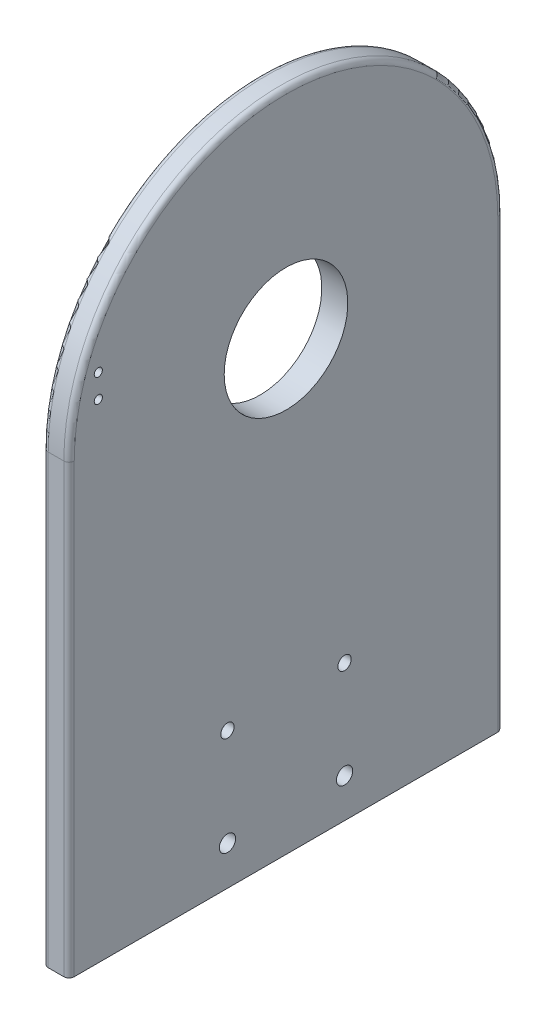
ISO-10303-21;
HEADER;
FILE_DESCRIPTION(('STEP AP214'),'2;1');
FILE_NAME('part.step','',(''),(''),'','','');
FILE_SCHEMA(('AUTOMOTIVE_DESIGN { 1 0 10303 214 1 1 1 1 }'));
ENDSEC;
DATA;
#1=APPLICATION_CONTEXT('core data for automotive mechanical design processes');
#2=APPLICATION_PROTOCOL_DEFINITION('international standard','automotive_design',2000,#1);
#3=PRODUCT_CONTEXT('',#1,'mechanical');
#4=PRODUCT('Part','Part','',(#3));
#5=PRODUCT_RELATED_PRODUCT_CATEGORY('part','',(#4));
#6=PRODUCT_DEFINITION_FORMATION('','',#4);
#7=PRODUCT_DEFINITION_CONTEXT('part definition',#1,'design');
#8=PRODUCT_DEFINITION('design','',#6,#7);
#9=PRODUCT_DEFINITION_SHAPE('','',#8);
#10=(LENGTH_UNIT() NAMED_UNIT(*) SI_UNIT(.MILLI.,.METRE.));
#11=(NAMED_UNIT(*) PLANE_ANGLE_UNIT() SI_UNIT($,.RADIAN.));
#12=(NAMED_UNIT(*) SI_UNIT($,.STERADIAN.) SOLID_ANGLE_UNIT());
#13=UNCERTAINTY_MEASURE_WITH_UNIT(LENGTH_MEASURE(1.E-05),#10,'distance_accuracy_value','');
#14=(GEOMETRIC_REPRESENTATION_CONTEXT(3) GLOBAL_UNCERTAINTY_ASSIGNED_CONTEXT((#13)) GLOBAL_UNIT_ASSIGNED_CONTEXT((#10,
#11,#12)) REPRESENTATION_CONTEXT('',''));
#15=CARTESIAN_POINT('',(0.,0.,0.));
#16=DIRECTION('',(0.,0.,1.));
#17=DIRECTION('',(1.,0.,0.));
#18=AXIS2_PLACEMENT_3D('',#15,#16,#17);
#19=CARTESIAN_POINT('',(-124.,102.,-33.35));
#20=DIRECTION('',(1.,0.,0.));
#21=DIRECTION('',(0.,0.,-1.));
#22=AXIS2_PLACEMENT_3D('',#19,#20,#21);
#23=PLANE('',#22);
#24=CARTESIAN_POINT('',(-124.,78.6,28.85));
#25=DIRECTION('',(-1.,0.,0.));
#26=DIRECTION('',(0.,0.,1.));
#27=AXIS2_PLACEMENT_3D('',#24,#25,#26);
#28=CIRCLE('',#27,0.824999999999992);
#29=CARTESIAN_POINT('',(-124.,78.6,29.675));
#30=VERTEX_POINT('',#29);
#31=EDGE_CURVE('E300',#30,#30,#28,.T.);
#32=ORIENTED_EDGE('',*,*,#31,.F.);
#33=EDGE_LOOP('',(#32));
#34=FACE_BOUND('',#33,.T.);
#35=CARTESIAN_POINT('',(-124.,75.,28.85));
#36=DIRECTION('',(-1.,0.,0.));
#37=DIRECTION('',(0.,0.,1.));
#38=AXIS2_PLACEMENT_3D('',#35,#36,#37);
#39=CIRCLE('',#38,0.825000000000006);
#40=CARTESIAN_POINT('',(-124.,75.,29.675));
#41=VERTEX_POINT('',#40);
#42=EDGE_CURVE('E291',#41,#41,#39,.T.);
#43=ORIENTED_EDGE('',*,*,#42,.F.);
#44=EDGE_LOOP('',(#43));
#45=FACE_BOUND('',#44,.T.);
#46=CARTESIAN_POINT('',(-124.,21.,9.));
#47=DIRECTION('',(-1.,0.,0.));
#48=DIRECTION('',(0.,0.,1.));
#49=AXIS2_PLACEMENT_3D('',#46,#47,#48);
#50=CIRCLE('',#49,1.275);
#51=CARTESIAN_POINT('',(-124.,21.,10.275));
#52=VERTEX_POINT('',#51);
#53=EDGE_CURVE('E171',#52,#52,#50,.T.);
#54=ORIENTED_EDGE('',*,*,#53,.F.);
#55=EDGE_LOOP('',(#54));
#56=FACE_BOUND('',#55,.T.);
#57=CARTESIAN_POINT('',(-124.,21.,-9.));
#58=DIRECTION('',(-1.,0.,0.));
#59=DIRECTION('',(0.,0.,1.));
#60=AXIS2_PLACEMENT_3D('',#57,#58,#59);
#61=CIRCLE('',#60,1.275);
#62=CARTESIAN_POINT('',(-124.,21.,-7.725));
#63=VERTEX_POINT('',#62);
#64=EDGE_CURVE('E275',#63,#63,#61,.T.);
#65=ORIENTED_EDGE('',*,*,#64,.F.);
#66=EDGE_LOOP('',(#65));
#67=FACE_BOUND('',#66,.T.);
#68=CARTESIAN_POINT('',(-124.,6.,9.00000000000001));
#69=DIRECTION('',(1.,0.,0.));
#70=DIRECTION('',(0.,0.,-1.));
#71=AXIS2_PLACEMENT_3D('',#68,#69,#70);
#72=CIRCLE('',#71,1.24999999999999);
#73=CARTESIAN_POINT('',(-124.,6.,7.75000000000002));
#74=VERTEX_POINT('',#73);
#75=EDGE_CURVE('E229',#74,#74,#72,.T.);
#76=ORIENTED_EDGE('',*,*,#75,.T.);
#77=EDGE_LOOP('',(#76));
#78=FACE_BOUND('',#77,.T.);
#79=CARTESIAN_POINT('',(-124.,6.,-8.99999999999999));
#80=DIRECTION('',(1.,0.,0.));
#81=DIRECTION('',(0.,0.,-1.));
#82=AXIS2_PLACEMENT_3D('',#79,#80,#81);
#83=CIRCLE('',#82,1.24999999999999);
#84=CARTESIAN_POINT('',(-124.,6.,-10.25));
#85=VERTEX_POINT('',#84);
#86=EDGE_CURVE('E226',#85,#85,#83,.T.);
#87=ORIENTED_EDGE('',*,*,#86,.T.);
#88=EDGE_LOOP('',(#87));
#89=FACE_BOUND('',#88,.T.);
#90=CARTESIAN_POINT('',(-124.,68.65,0.));
#91=DIRECTION('',(-1.,0.,0.));
#92=DIRECTION('',(0.,0.,1.));
#93=AXIS2_PLACEMENT_3D('',#90,#91,#92);
#94=CIRCLE('',#93,9.5);
#95=CARTESIAN_POINT('',(-124.,68.65,9.5));
#96=VERTEX_POINT('',#95);
#97=EDGE_CURVE('E260',#96,#96,#94,.T.);
#98=ORIENTED_EDGE('',*,*,#97,.F.);
#99=EDGE_LOOP('',(#98));
#100=FACE_BOUND('',#99,.T.);
#101=DIRECTION('',(0.,0.,-1.));
#102=VECTOR('',#101,1.);
#103=CARTESIAN_POINT('',(-124.,0.,33.35));
#104=LINE('',#103,#102);
#105=CARTESIAN_POINT('',(-124.,0.,32.55));
#106=VERTEX_POINT('',#105);
#107=CARTESIAN_POINT('',(-124.,0.,-32.55));
#108=VERTEX_POINT('',#107);
#109=EDGE_CURVE('E225',#106,#108,#104,.T.);
#110=ORIENTED_EDGE('',*,*,#109,.F.);
#111=DIRECTION('',(0.,-1.,0.));
#112=VECTOR('',#111,1.);
#113=CARTESIAN_POINT('',(-124.,102.,32.55));
#114=LINE('',#113,#112);
#115=CARTESIAN_POINT('',(-124.,68.65,32.55));
#116=VERTEX_POINT('',#115);
#117=EDGE_CURVE('E176',#106,#116,#114,.F.);
#118=ORIENTED_EDGE('',*,*,#117,.T.);
#119=CARTESIAN_POINT('',(-124.,68.65,0.));
#120=DIRECTION('',(1.,0.,0.));
#121=DIRECTION('',(0.,0.,-1.));
#122=AXIS2_PLACEMENT_3D('',#119,#120,#121);
#123=CIRCLE('',#122,32.55);
#124=CARTESIAN_POINT('',(-124.,68.65,-32.55));
#125=VERTEX_POINT('',#124);
#126=EDGE_CURVE('E180',#116,#125,#123,.F.);
#127=ORIENTED_EDGE('',*,*,#126,.T.);
#128=DIRECTION('',(0.,-1.,0.));
#129=VECTOR('',#128,1.);
#130=CARTESIAN_POINT('',(-124.,102.,-32.55));
#131=LINE('',#130,#129);
#132=EDGE_CURVE('E237',#125,#108,#131,.T.);
#133=ORIENTED_EDGE('',*,*,#132,.T.);
#134=EDGE_LOOP('',(#110,#118,#127,#133));
#135=FACE_BOUND('',#134,.T.);
#136=ADVANCED_FACE('F77',(#34,#45,#56,#67,#78,#89,#100,#135),#23,.F.);
#137=CARTESIAN_POINT('',(-20.,2.,-33.35));
#138=DIRECTION('',(0.,0.,1.));
#139=DIRECTION('',(1.,0.,0.));
#140=AXIS2_PLACEMENT_3D('',#137,#138,#139);
#141=PLANE('',#140);
#142=DIRECTION('',(-1.,0.,0.));
#143=VECTOR('',#142,1.);
#144=CARTESIAN_POINT('',(-124.,0.8,-33.35));
#145=LINE('',#144,#143);
#146=CARTESIAN_POINT('',(-120.8,0.8,-33.35));
#147=VERTEX_POINT('',#146);
#148=CARTESIAN_POINT('',(-123.2,0.8,-33.35));
#149=VERTEX_POINT('',#148);
#150=EDGE_CURVE('E86',#147,#149,#145,.T.);
#151=ORIENTED_EDGE('',*,*,#150,.T.);
#152=DIRECTION('',(0.,-1.,0.));
#153=VECTOR('',#152,1.);
#154=CARTESIAN_POINT('',(-123.2,2.,-33.35));
#155=LINE('',#154,#153);
#156=CARTESIAN_POINT('',(-123.2,68.65,-33.35));
#157=VERTEX_POINT('',#156);
#158=EDGE_CURVE('E12',#149,#157,#155,.F.);
#159=ORIENTED_EDGE('',*,*,#158,.T.);
#160=DIRECTION('',(-1.,0.,0.));
#161=VECTOR('',#160,1.);
#162=CARTESIAN_POINT('',(20.,68.65,-33.35));
#163=LINE('',#162,#161);
#164=CARTESIAN_POINT('',(-120.8,68.65,-33.35));
#165=VERTEX_POINT('',#164);
#166=EDGE_CURVE('E163',#165,#157,#163,.T.);
#167=ORIENTED_EDGE('',*,*,#166,.F.);
#168=DIRECTION('',(0.,-1.,0.));
#169=VECTOR('',#168,1.);
#170=CARTESIAN_POINT('',(-120.8,2.,-33.35));
#171=LINE('',#170,#169);
#172=EDGE_CURVE('E97',#165,#147,#171,.T.);
#173=ORIENTED_EDGE('',*,*,#172,.T.);
#174=EDGE_LOOP('',(#151,#159,#167,#173));
#175=FACE_BOUND('',#174,.T.);
#176=ADVANCED_FACE('F214',(#175),#141,.F.);
#177=CARTESIAN_POINT('',(-20.,2.,33.35));
#178=DIRECTION('',(0.,0.,-1.));
#179=DIRECTION('',(-1.,0.,0.));
#180=AXIS2_PLACEMENT_3D('',#177,#178,#179);
#181=PLANE('',#180);
#182=DIRECTION('',(-1.,0.,0.));
#183=VECTOR('',#182,1.);
#184=CARTESIAN_POINT('',(20.,68.65,33.35));
#185=LINE('',#184,#183);
#186=CARTESIAN_POINT('',(-120.8,68.65,33.35));
#187=VERTEX_POINT('',#186);
#188=CARTESIAN_POINT('',(-123.2,68.65,33.35));
#189=VERTEX_POINT('',#188);
#190=EDGE_CURVE('E147',#187,#189,#185,.T.);
#191=ORIENTED_EDGE('',*,*,#190,.T.);
#192=DIRECTION('',(0.,-1.,0.));
#193=VECTOR('',#192,1.);
#194=CARTESIAN_POINT('',(-123.2,2.,33.35));
#195=LINE('',#194,#193);
#196=CARTESIAN_POINT('',(-123.2,0.,33.35));
#197=VERTEX_POINT('',#196);
#198=EDGE_CURVE('E154',#189,#197,#195,.T.);
#199=ORIENTED_EDGE('',*,*,#198,.T.);
#200=DIRECTION('',(1.,0.,0.));
#201=VECTOR('',#200,1.);
#202=CARTESIAN_POINT('',(-120.,0.,33.35));
#203=LINE('',#202,#201);
#204=CARTESIAN_POINT('',(-120.8,0.,33.35));
#205=VERTEX_POINT('',#204);
#206=EDGE_CURVE('E150',#197,#205,#203,.T.);
#207=ORIENTED_EDGE('',*,*,#206,.T.);
#208=DIRECTION('',(0.,-1.,0.));
#209=VECTOR('',#208,1.);
#210=CARTESIAN_POINT('',(-120.8,2.,33.35));
#211=LINE('',#210,#209);
#212=EDGE_CURVE('E143',#205,#187,#211,.F.);
#213=ORIENTED_EDGE('',*,*,#212,.T.);
#214=EDGE_LOOP('',(#191,#199,#207,#213));
#215=FACE_BOUND('',#214,.T.);
#216=ADVANCED_FACE('F145',(#215),#181,.F.);
#217=CARTESIAN_POINT('',(-120.,102.,-33.35));
#218=DIRECTION('',(-1.,0.,0.));
#219=DIRECTION('',(0.,0.,1.));
#220=AXIS2_PLACEMENT_3D('',#217,#218,#219);
#221=PLANE('',#220);
#222=CARTESIAN_POINT('',(-120.,78.6,28.85));
#223=DIRECTION('',(-1.,0.,0.));
#224=DIRECTION('',(0.,0.,1.));
#225=AXIS2_PLACEMENT_3D('',#222,#223,#224);
#226=CIRCLE('',#225,0.625000000000001);
#227=CARTESIAN_POINT('',(-120.,78.6,29.475));
#228=VERTEX_POINT('',#227);
#229=EDGE_CURVE('E294',#228,#228,#226,.T.);
#230=ORIENTED_EDGE('',*,*,#229,.T.);
#231=EDGE_LOOP('',(#230));
#232=FACE_BOUND('',#231,.T.);
#233=CARTESIAN_POINT('',(-120.,75.,28.85));
#234=DIRECTION('',(-1.,0.,0.));
#235=DIRECTION('',(0.,0.,1.));
#236=AXIS2_PLACEMENT_3D('',#233,#234,#235);
#237=CIRCLE('',#236,0.625000000000001);
#238=CARTESIAN_POINT('',(-120.,75.,29.475));
#239=VERTEX_POINT('',#238);
#240=EDGE_CURVE('E194',#239,#239,#237,.T.);
#241=ORIENTED_EDGE('',*,*,#240,.T.);
#242=EDGE_LOOP('',(#241));
#243=FACE_BOUND('',#242,.T.);
#244=CARTESIAN_POINT('',(-120.,21.,9.));
#245=DIRECTION('',(-1.,0.,0.));
#246=DIRECTION('',(0.,0.,1.));
#247=AXIS2_PLACEMENT_3D('',#244,#245,#246);
#248=CIRCLE('',#247,1.025);
#249=CARTESIAN_POINT('',(-120.,21.,10.025));
#250=VERTEX_POINT('',#249);
#251=EDGE_CURVE('E278',#250,#250,#248,.T.);
#252=ORIENTED_EDGE('',*,*,#251,.T.);
#253=EDGE_LOOP('',(#252));
#254=FACE_BOUND('',#253,.T.);
#255=CARTESIAN_POINT('',(-120.,21.,-9.));
#256=DIRECTION('',(-1.,0.,0.));
#257=DIRECTION('',(0.,0.,1.));
#258=AXIS2_PLACEMENT_3D('',#255,#256,#257);
#259=CIRCLE('',#258,1.025);
#260=CARTESIAN_POINT('',(-120.,21.,-7.975));
#261=VERTEX_POINT('',#260);
#262=EDGE_CURVE('E269',#261,#261,#259,.T.);
#263=ORIENTED_EDGE('',*,*,#262,.T.);
#264=EDGE_LOOP('',(#263));
#265=FACE_BOUND('',#264,.T.);
#266=CARTESIAN_POINT('',(-120.,6.,9.00000000000001));
#267=DIRECTION('',(-1.,0.,0.));
#268=DIRECTION('',(0.,0.,1.));
#269=AXIS2_PLACEMENT_3D('',#266,#267,#268);
#270=CIRCLE('',#269,1.24999999999999);
#271=CARTESIAN_POINT('',(-120.,6.,10.25));
#272=VERTEX_POINT('',#271);
#273=EDGE_CURVE('E227',#272,#272,#270,.T.);
#274=ORIENTED_EDGE('',*,*,#273,.T.);
#275=EDGE_LOOP('',(#274));
#276=FACE_BOUND('',#275,.T.);
#277=CARTESIAN_POINT('',(-120.,6.,-8.99999999999999));
#278=DIRECTION('',(-1.,0.,0.));
#279=DIRECTION('',(0.,0.,1.));
#280=AXIS2_PLACEMENT_3D('',#277,#278,#279);
#281=CIRCLE('',#280,1.24999999999999);
#282=CARTESIAN_POINT('',(-120.,6.,-7.75));
#283=VERTEX_POINT('',#282);
#284=EDGE_CURVE('E222',#283,#283,#281,.T.);
#285=ORIENTED_EDGE('',*,*,#284,.T.);
#286=EDGE_LOOP('',(#285));
#287=FACE_BOUND('',#286,.T.);
#288=CARTESIAN_POINT('',(-120.,68.65,0.));
#289=DIRECTION('',(-1.,0.,0.));
#290=DIRECTION('',(0.,0.,1.));
#291=AXIS2_PLACEMENT_3D('',#288,#289,#290);
#292=CIRCLE('',#291,32.55);
#293=CARTESIAN_POINT('',(-120.,68.65,-32.55));
#294=VERTEX_POINT('',#293);
#295=CARTESIAN_POINT('',(-120.,68.65,32.55));
#296=VERTEX_POINT('',#295);
#297=EDGE_CURVE('E185',#294,#296,#292,.F.);
#298=ORIENTED_EDGE('',*,*,#297,.T.);
#299=DIRECTION('',(0.,-1.,0.));
#300=VECTOR('',#299,1.);
#301=CARTESIAN_POINT('',(-120.,102.,32.55));
#302=LINE('',#301,#300);
#303=CARTESIAN_POINT('',(-120.,0.,32.55));
#304=VERTEX_POINT('',#303);
#305=EDGE_CURVE('E168',#296,#304,#302,.T.);
#306=ORIENTED_EDGE('',*,*,#305,.T.);
#307=DIRECTION('',(0.,0.,-1.));
#308=VECTOR('',#307,1.);
#309=CARTESIAN_POINT('',(-120.,0.,-33.35));
#310=LINE('',#309,#308);
#311=CARTESIAN_POINT('',(-120.,0.,-32.55));
#312=VERTEX_POINT('',#311);
#313=EDGE_CURVE('E215',#304,#312,#310,.T.);
#314=ORIENTED_EDGE('',*,*,#313,.T.);
#315=DIRECTION('',(0.,-1.,0.));
#316=VECTOR('',#315,1.);
#317=CARTESIAN_POINT('',(-120.,102.,-32.55));
#318=LINE('',#317,#316);
#319=EDGE_CURVE('E178',#312,#294,#318,.F.);
#320=ORIENTED_EDGE('',*,*,#319,.T.);
#321=EDGE_LOOP('',(#298,#306,#314,#320));
#322=FACE_BOUND('',#321,.T.);
#323=CARTESIAN_POINT('',(-120.,68.65,0.));
#324=DIRECTION('',(-1.,0.,0.));
#325=DIRECTION('',(0.,0.,1.));
#326=AXIS2_PLACEMENT_3D('',#323,#324,#325);
#327=CIRCLE('',#326,9.5);
#328=CARTESIAN_POINT('',(-120.,68.65,9.5));
#329=VERTEX_POINT('',#328);
#330=EDGE_CURVE('E164',#329,#329,#327,.F.);
#331=ORIENTED_EDGE('',*,*,#330,.F.);
#332=EDGE_LOOP('',(#331));
#333=FACE_BOUND('',#332,.T.);
#334=ADVANCED_FACE('F252',(#232,#243,#254,#265,#276,#287,#322,#333),#221,.F.);
#335=CARTESIAN_POINT('',(0.,0.,0.));
#336=DIRECTION('',(0.,-1.,0.));
#337=DIRECTION('',(0.,0.,-1.));
#338=AXIS2_PLACEMENT_3D('',#335,#336,#337);
#339=PLANE('',#338);
#340=ORIENTED_EDGE('',*,*,#206,.F.);
#341=CARTESIAN_POINT('',(-123.2,0.,32.55));
#342=DIRECTION('',(0.,-1.,0.));
#343=DIRECTION('',(0.,0.,-1.));
#344=AXIS2_PLACEMENT_3D('',#341,#342,#343);
#345=CIRCLE('',#344,0.8);
#346=EDGE_CURVE('E235',#197,#106,#345,.T.);
#347=ORIENTED_EDGE('',*,*,#346,.T.);
#348=ORIENTED_EDGE('',*,*,#109,.T.);
#349=DIRECTION('',(-1.,0.,0.));
#350=VECTOR('',#349,1.);
#351=CARTESIAN_POINT('',(-120.,0.,-32.55));
#352=LINE('',#351,#350);
#353=EDGE_CURVE('E209',#108,#312,#352,.F.);
#354=ORIENTED_EDGE('',*,*,#353,.T.);
#355=ORIENTED_EDGE('',*,*,#313,.F.);
#356=CARTESIAN_POINT('',(-120.8,0.,32.55));
#357=DIRECTION('',(0.,-1.,0.));
#358=DIRECTION('',(0.,0.,-1.));
#359=AXIS2_PLACEMENT_3D('',#356,#357,#358);
#360=CIRCLE('',#359,0.8);
#361=EDGE_CURVE('E233',#304,#205,#360,.T.);
#362=ORIENTED_EDGE('',*,*,#361,.T.);
#363=EDGE_LOOP('',(#340,#347,#348,#354,#355,#362));
#364=FACE_BOUND('',#363,.T.);
#365=ADVANCED_FACE('F249',(#364),#339,.T.);
#366=CARTESIAN_POINT('',(20.,68.65,0.));
#367=DIRECTION('',(-1.,0.,0.));
#368=DIRECTION('',(0.,0.,1.));
#369=AXIS2_PLACEMENT_3D('',#366,#367,#368);
#370=CYLINDRICAL_SURFACE('',#369,33.35);
#371=ORIENTED_EDGE('',*,*,#166,.T.);
#372=CARTESIAN_POINT('',(-123.2,68.65,0.));
#373=DIRECTION('',(1.,0.,0.));
#374=DIRECTION('',(0.,0.,-1.));
#375=AXIS2_PLACEMENT_3D('',#372,#373,#374);
#376=CIRCLE('',#375,33.35);
#377=EDGE_CURVE('E162',#157,#189,#376,.T.);
#378=ORIENTED_EDGE('',*,*,#377,.T.);
#379=ORIENTED_EDGE('',*,*,#190,.F.);
#380=CARTESIAN_POINT('',(-120.8,68.65,0.));
#381=DIRECTION('',(-1.,0.,0.));
#382=DIRECTION('',(0.,0.,1.));
#383=AXIS2_PLACEMENT_3D('',#380,#381,#382);
#384=CIRCLE('',#383,33.35);
#385=EDGE_CURVE('E160',#187,#165,#384,.T.);
#386=ORIENTED_EDGE('',*,*,#385,.T.);
#387=EDGE_LOOP('',(#371,#378,#379,#386));
#388=FACE_BOUND('',#387,.T.);
#389=ADVANCED_FACE('F158',(#388),#370,.T.);
#390=CARTESIAN_POINT('',(20.001,68.65,0.));
#391=DIRECTION('',(-1.,0.,0.));
#392=DIRECTION('',(0.,0.,1.));
#393=AXIS2_PLACEMENT_3D('',#390,#391,#392);
#394=CYLINDRICAL_SURFACE('',#393,9.5);
#395=ORIENTED_EDGE('',*,*,#97,.T.);
#396=EDGE_LOOP('',(#395));
#397=FACE_BOUND('',#396,.T.);
#398=ORIENTED_EDGE('',*,*,#330,.T.);
#399=EDGE_LOOP('',(#398));
#400=FACE_BOUND('',#399,.T.);
#401=ADVANCED_FACE('F321',(#397,#400),#394,.F.);
#402=CARTESIAN_POINT('',(-16.,6.,-9.));
#403=DIRECTION('',(1.,0.,0.));
#404=DIRECTION('',(0.,0.,-1.));
#405=AXIS2_PLACEMENT_3D('',#402,#403,#404);
#406=CYLINDRICAL_SURFACE('',#405,1.24999999999999);
#407=ORIENTED_EDGE('',*,*,#86,.F.);
#408=EDGE_LOOP('',(#407));
#409=FACE_BOUND('',#408,.T.);
#410=ORIENTED_EDGE('',*,*,#284,.F.);
#411=EDGE_LOOP('',(#410));
#412=FACE_BOUND('',#411,.T.);
#413=ADVANCED_FACE('F323',(#409,#412),#406,.F.);
#414=CARTESIAN_POINT('',(-16.,6.,9.));
#415=DIRECTION('',(1.,0.,0.));
#416=DIRECTION('',(0.,0.,-1.));
#417=AXIS2_PLACEMENT_3D('',#414,#415,#416);
#418=CYLINDRICAL_SURFACE('',#417,1.24999999999999);
#419=ORIENTED_EDGE('',*,*,#75,.F.);
#420=EDGE_LOOP('',(#419));
#421=FACE_BOUND('',#420,.T.);
#422=ORIENTED_EDGE('',*,*,#273,.F.);
#423=EDGE_LOOP('',(#422));
#424=FACE_BOUND('',#423,.T.);
#425=ADVANCED_FACE('F329',(#421,#424),#418,.F.);
#426=CARTESIAN_POINT('',(-124.,21.,-9.));
#427=DIRECTION('',(-1.,0.,0.));
#428=DIRECTION('',(0.,0.,1.));
#429=AXIS2_PLACEMENT_3D('',#426,#427,#428);
#430=CYLINDRICAL_SURFACE('',#429,1.02499999999999);
#431=ORIENTED_EDGE('',*,*,#262,.F.);
#432=EDGE_LOOP('',(#431));
#433=FACE_BOUND('',#432,.T.);
#434=CARTESIAN_POINT('',(-123.75,21.,-9.));
#435=DIRECTION('',(-1.,0.,0.));
#436=DIRECTION('',(0.,0.,1.));
#437=AXIS2_PLACEMENT_3D('',#434,#435,#436);
#438=CIRCLE('',#437,1.02499999999999);
#439=CARTESIAN_POINT('',(-123.75,21.,-7.97500000000001));
#440=VERTEX_POINT('',#439);
#441=EDGE_CURVE('E272',#440,#440,#438,.T.);
#442=ORIENTED_EDGE('',*,*,#441,.T.);
#443=EDGE_LOOP('',(#442));
#444=FACE_BOUND('',#443,.T.);
#445=ADVANCED_FACE('F376',(#433,#444),#430,.F.);
#446=CARTESIAN_POINT('',(-124.,21.,-9.));
#447=DIRECTION('',(-1.,0.,0.));
#448=DIRECTION('',(0.,0.,1.));
#449=AXIS2_PLACEMENT_3D('',#446,#447,#448);
#450=CONICAL_SURFACE('',#449,1.275,0.785398163397448);
#451=ORIENTED_EDGE('',*,*,#441,.F.);
#452=EDGE_LOOP('',(#451));
#453=FACE_BOUND('',#452,.T.);
#454=ORIENTED_EDGE('',*,*,#64,.T.);
#455=EDGE_LOOP('',(#454));
#456=FACE_BOUND('',#455,.T.);
#457=ADVANCED_FACE('F366',(#453,#456),#450,.F.);
#458=CARTESIAN_POINT('',(-124.,21.,9.));
#459=DIRECTION('',(-1.,0.,0.));
#460=DIRECTION('',(0.,0.,1.));
#461=AXIS2_PLACEMENT_3D('',#458,#459,#460);
#462=CYLINDRICAL_SURFACE('',#461,1.02499999999999);
#463=ORIENTED_EDGE('',*,*,#251,.F.);
#464=EDGE_LOOP('',(#463));
#465=FACE_BOUND('',#464,.T.);
#466=CARTESIAN_POINT('',(-123.75,21.,9.));
#467=DIRECTION('',(-1.,0.,0.));
#468=DIRECTION('',(0.,0.,1.));
#469=AXIS2_PLACEMENT_3D('',#466,#467,#468);
#470=CIRCLE('',#469,1.02499999999999);
#471=CARTESIAN_POINT('',(-123.75,21.,10.025));
#472=VERTEX_POINT('',#471);
#473=EDGE_CURVE('E281',#472,#472,#470,.T.);
#474=ORIENTED_EDGE('',*,*,#473,.T.);
#475=EDGE_LOOP('',(#474));
#476=FACE_BOUND('',#475,.T.);
#477=ADVANCED_FACE('F360',(#465,#476),#462,.F.);
#478=CARTESIAN_POINT('',(-124.,21.,9.));
#479=DIRECTION('',(-1.,0.,0.));
#480=DIRECTION('',(0.,0.,1.));
#481=AXIS2_PLACEMENT_3D('',#478,#479,#480);
#482=CONICAL_SURFACE('',#481,1.275,0.785398163397448);
#483=ORIENTED_EDGE('',*,*,#473,.F.);
#484=EDGE_LOOP('',(#483));
#485=FACE_BOUND('',#484,.T.);
#486=ORIENTED_EDGE('',*,*,#53,.T.);
#487=EDGE_LOOP('',(#486));
#488=FACE_BOUND('',#487,.T.);
#489=ADVANCED_FACE('F356',(#485,#488),#482,.F.);
#490=CARTESIAN_POINT('',(-120.8,102.,32.55));
#491=DIRECTION('',(0.,-1.,0.));
#492=DIRECTION('',(0.,0.,-1.));
#493=AXIS2_PLACEMENT_3D('',#490,#491,#492);
#494=CYLINDRICAL_SURFACE('',#493,0.8);
#495=ORIENTED_EDGE('',*,*,#361,.F.);
#496=ORIENTED_EDGE('',*,*,#305,.F.);
#497=CARTESIAN_POINT('',(-120.8,68.65,32.55));
#498=DIRECTION('',(0.,1.,0.));
#499=DIRECTION('',(0.,0.,1.));
#500=AXIS2_PLACEMENT_3D('',#497,#498,#499);
#501=CIRCLE('',#500,0.8);
#502=EDGE_CURVE('E81',#187,#296,#501,.T.);
#503=ORIENTED_EDGE('',*,*,#502,.F.);
#504=ORIENTED_EDGE('',*,*,#212,.F.);
#505=EDGE_LOOP('',(#495,#496,#503,#504));
#506=FACE_BOUND('',#505,.T.);
#507=ADVANCED_FACE('F79',(#506),#494,.T.);
#508=CARTESIAN_POINT('',(-120.8,68.65,0.));
#509=DIRECTION('',(-1.,0.,0.));
#510=DIRECTION('',(0.,0.,1.));
#511=AXIS2_PLACEMENT_3D('',#508,#509,#510);
#512=TOROIDAL_SURFACE('',#511,32.55,0.8);
#513=ORIENTED_EDGE('',*,*,#502,.T.);
#514=ORIENTED_EDGE('',*,*,#297,.F.);
#515=CARTESIAN_POINT('',(-120.8,68.65,-32.55));
#516=DIRECTION('',(0.,-1.,0.));
#517=DIRECTION('',(0.,0.,-1.));
#518=AXIS2_PLACEMENT_3D('',#515,#516,#517);
#519=CIRCLE('',#518,0.8);
#520=EDGE_CURVE('E172',#165,#294,#519,.T.);
#521=ORIENTED_EDGE('',*,*,#520,.F.);
#522=ORIENTED_EDGE('',*,*,#385,.F.);
#523=EDGE_LOOP('',(#513,#514,#521,#522));
#524=FACE_BOUND('',#523,.T.);
#525=ADVANCED_FACE('F174',(#524),#512,.T.);
#526=CARTESIAN_POINT('',(-120.8,2.,-32.55));
#527=DIRECTION('',(0.,-1.,0.));
#528=DIRECTION('',(0.,0.,-1.));
#529=AXIS2_PLACEMENT_3D('',#526,#527,#528);
#530=CYLINDRICAL_SURFACE('',#529,0.8);
#531=ORIENTED_EDGE('',*,*,#520,.T.);
#532=ORIENTED_EDGE('',*,*,#319,.F.);
#533=CARTESIAN_POINT('',(-120.8,0.8,-32.55));
#534=DIRECTION('',(-0.707106781186547,-0.707106781186547,0.));
#535=DIRECTION('',(0.707106781186547,-0.707106781186547,0.));
#536=AXIS2_PLACEMENT_3D('',#533,#534,#535);
#537=ELLIPSE('',#536,1.13137084989848,0.8);
#538=EDGE_CURVE('E200',#147,#312,#537,.T.);
#539=ORIENTED_EDGE('',*,*,#538,.F.);
#540=ORIENTED_EDGE('',*,*,#172,.F.);
#541=EDGE_LOOP('',(#531,#532,#539,#540));
#542=FACE_BOUND('',#541,.T.);
#543=ADVANCED_FACE('F204',(#542),#530,.T.);
#544=CARTESIAN_POINT('',(-20.,0.8,-32.55));
#545=DIRECTION('',(1.,0.,0.));
#546=DIRECTION('',(0.,0.,-1.));
#547=AXIS2_PLACEMENT_3D('',#544,#545,#546);
#548=CYLINDRICAL_SURFACE('',#547,0.8);
#549=ORIENTED_EDGE('',*,*,#538,.T.);
#550=ORIENTED_EDGE('',*,*,#353,.F.);
#551=CARTESIAN_POINT('',(-123.2,0.799999999999997,-32.55));
#552=DIRECTION('',(0.707106781186547,-0.707106781186547,0.));
#553=DIRECTION('',(0.707106781186547,0.707106781186547,0.));
#554=AXIS2_PLACEMENT_3D('',#551,#552,#553);
#555=ELLIPSE('',#554,1.13137084989848,0.8);
#556=EDGE_CURVE('E197',#149,#108,#555,.F.);
#557=ORIENTED_EDGE('',*,*,#556,.F.);
#558=ORIENTED_EDGE('',*,*,#150,.F.);
#559=EDGE_LOOP('',(#549,#550,#557,#558));
#560=FACE_BOUND('',#559,.T.);
#561=ADVANCED_FACE('F207',(#560),#548,.T.);
#562=CARTESIAN_POINT('',(-123.2,102.,-32.55));
#563=DIRECTION('',(0.,-1.,0.));
#564=DIRECTION('',(0.,0.,-1.));
#565=AXIS2_PLACEMENT_3D('',#562,#563,#564);
#566=CYLINDRICAL_SURFACE('',#565,0.8);
#567=ORIENTED_EDGE('',*,*,#556,.T.);
#568=ORIENTED_EDGE('',*,*,#132,.F.);
#569=CARTESIAN_POINT('',(-123.2,68.65,-32.55));
#570=DIRECTION('',(0.,1.,0.));
#571=DIRECTION('',(0.,0.,1.));
#572=AXIS2_PLACEMENT_3D('',#569,#570,#571);
#573=CIRCLE('',#572,0.8);
#574=EDGE_CURVE('E193',#157,#125,#573,.T.);
#575=ORIENTED_EDGE('',*,*,#574,.F.);
#576=ORIENTED_EDGE('',*,*,#158,.F.);
#577=EDGE_LOOP('',(#567,#568,#575,#576));
#578=FACE_BOUND('',#577,.T.);
#579=ADVANCED_FACE('F213',(#578),#566,.T.);
#580=CARTESIAN_POINT('',(-123.2,68.65,0.));
#581=DIRECTION('',(1.,0.,0.));
#582=DIRECTION('',(0.,0.,-1.));
#583=AXIS2_PLACEMENT_3D('',#580,#581,#582);
#584=TOROIDAL_SURFACE('',#583,32.55,0.8);
#585=ORIENTED_EDGE('',*,*,#574,.T.);
#586=ORIENTED_EDGE('',*,*,#126,.F.);
#587=CARTESIAN_POINT('',(-123.2,68.65,32.55));
#588=DIRECTION('',(0.,-1.,0.));
#589=DIRECTION('',(0.,0.,-1.));
#590=AXIS2_PLACEMENT_3D('',#587,#588,#589);
#591=CIRCLE('',#590,0.8);
#592=EDGE_CURVE('E190',#189,#116,#591,.T.);
#593=ORIENTED_EDGE('',*,*,#592,.F.);
#594=ORIENTED_EDGE('',*,*,#377,.F.);
#595=EDGE_LOOP('',(#585,#586,#593,#594));
#596=FACE_BOUND('',#595,.T.);
#597=ADVANCED_FACE('F244',(#596),#584,.T.);
#598=CARTESIAN_POINT('',(-123.2,2.,32.55));
#599=DIRECTION('',(0.,-1.,0.));
#600=DIRECTION('',(0.,0.,-1.));
#601=AXIS2_PLACEMENT_3D('',#598,#599,#600);
#602=CYLINDRICAL_SURFACE('',#601,0.8);
#603=ORIENTED_EDGE('',*,*,#592,.T.);
#604=ORIENTED_EDGE('',*,*,#117,.F.);
#605=ORIENTED_EDGE('',*,*,#346,.F.);
#606=ORIENTED_EDGE('',*,*,#198,.F.);
#607=EDGE_LOOP('',(#603,#604,#605,#606));
#608=FACE_BOUND('',#607,.T.);
#609=ADVANCED_FACE('F247',(#608),#602,.T.);
#610=CARTESIAN_POINT('',(-124.,75.,28.85));
#611=DIRECTION('',(-1.,0.,0.));
#612=DIRECTION('',(0.,0.,1.));
#613=AXIS2_PLACEMENT_3D('',#610,#611,#612);
#614=CYLINDRICAL_SURFACE('',#613,0.624999999999994);
#615=ORIENTED_EDGE('',*,*,#240,.F.);
#616=EDGE_LOOP('',(#615));
#617=FACE_BOUND('',#616,.T.);
#618=CARTESIAN_POINT('',(-123.8,75.,28.85));
#619=DIRECTION('',(-1.,0.,0.));
#620=DIRECTION('',(0.,0.,1.));
#621=AXIS2_PLACEMENT_3D('',#618,#619,#620);
#622=CIRCLE('',#621,0.624999999999987);
#623=CARTESIAN_POINT('',(-123.8,75.,29.475));
#624=VERTEX_POINT('',#623);
#625=EDGE_CURVE('E288',#624,#624,#622,.T.);
#626=ORIENTED_EDGE('',*,*,#625,.T.);
#627=EDGE_LOOP('',(#626));
#628=FACE_BOUND('',#627,.T.);
#629=ADVANCED_FACE('F344',(#617,#628),#614,.F.);
#630=CARTESIAN_POINT('',(-124.,75.,28.85));
#631=DIRECTION('',(-1.,0.,0.));
#632=DIRECTION('',(0.,0.,1.));
#633=AXIS2_PLACEMENT_3D('',#630,#631,#632);
#634=CONICAL_SURFACE('',#633,0.825000000000006,0.785398163397483);
#635=ORIENTED_EDGE('',*,*,#625,.F.);
#636=EDGE_LOOP('',(#635));
#637=FACE_BOUND('',#636,.T.);
#638=ORIENTED_EDGE('',*,*,#42,.T.);
#639=EDGE_LOOP('',(#638));
#640=FACE_BOUND('',#639,.T.);
#641=ADVANCED_FACE('F484',(#637,#640),#634,.F.);
#642=CARTESIAN_POINT('',(-124.,78.6,28.85));
#643=DIRECTION('',(-1.,0.,0.));
#644=DIRECTION('',(0.,0.,1.));
#645=AXIS2_PLACEMENT_3D('',#642,#643,#644);
#646=CYLINDRICAL_SURFACE('',#645,0.624999999999994);
#647=ORIENTED_EDGE('',*,*,#229,.F.);
#648=EDGE_LOOP('',(#647));
#649=FACE_BOUND('',#648,.T.);
#650=CARTESIAN_POINT('',(-123.8,78.6,28.85));
#651=DIRECTION('',(-1.,0.,0.));
#652=DIRECTION('',(0.,0.,1.));
#653=AXIS2_PLACEMENT_3D('',#650,#651,#652);
#654=CIRCLE('',#653,0.624999999999987);
#655=CARTESIAN_POINT('',(-123.8,78.6,29.475));
#656=VERTEX_POINT('',#655);
#657=EDGE_CURVE('E297',#656,#656,#654,.T.);
#658=ORIENTED_EDGE('',*,*,#657,.T.);
#659=EDGE_LOOP('',(#658));
#660=FACE_BOUND('',#659,.T.);
#661=ADVANCED_FACE('F493',(#649,#660),#646,.F.);
#662=CARTESIAN_POINT('',(-124.,78.6,28.85));
#663=DIRECTION('',(-1.,0.,0.));
#664=DIRECTION('',(0.,0.,1.));
#665=AXIS2_PLACEMENT_3D('',#662,#663,#664);
#666=CONICAL_SURFACE('',#665,0.824999999999992,0.785398163397448);
#667=ORIENTED_EDGE('',*,*,#657,.F.);
#668=EDGE_LOOP('',(#667));
#669=FACE_BOUND('',#668,.T.);
#670=ORIENTED_EDGE('',*,*,#31,.T.);
#671=EDGE_LOOP('',(#670));
#672=FACE_BOUND('',#671,.T.);
#673=ADVANCED_FACE('F304',(#669,#672),#666,.F.);
#674=CLOSED_SHELL('',(#136,#176,#216,#334,#365,#389,#401,#413,#425,#445,#457,#477,#489,#507,
#525,#543,#561,#579,#597,#609,#629,#641,#661,#673));
#675=MANIFOLD_SOLID_BREP('B2',#674);
#676=ADVANCED_BREP_SHAPE_REPRESENTATION('',(#18,#675),#14);
#677=SHAPE_DEFINITION_REPRESENTATION(#9,#676);
ENDSEC;
END-ISO-10303-21;
